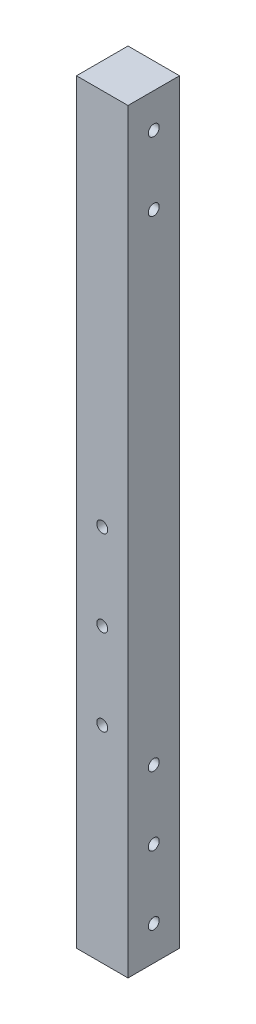
ISO-10303-21;
HEADER;
FILE_DESCRIPTION(('STEP AP214'),'2;1');
FILE_NAME('part.step','',(''),(''),'','','');
FILE_SCHEMA(('AUTOMOTIVE_DESIGN { 1 0 10303 214 1 1 1 1 }'));
ENDSEC;
DATA;
#1=APPLICATION_CONTEXT('core data for automotive mechanical design processes');
#2=APPLICATION_PROTOCOL_DEFINITION('international standard','automotive_design',2000,#1);
#3=PRODUCT_CONTEXT('',#1,'mechanical');
#4=PRODUCT('Part','Part','',(#3));
#5=PRODUCT_RELATED_PRODUCT_CATEGORY('part','',(#4));
#6=PRODUCT_DEFINITION_FORMATION('','',#4);
#7=PRODUCT_DEFINITION_CONTEXT('part definition',#1,'design');
#8=PRODUCT_DEFINITION('design','',#6,#7);
#9=PRODUCT_DEFINITION_SHAPE('','',#8);
#10=(LENGTH_UNIT() NAMED_UNIT(*) SI_UNIT(.MILLI.,.METRE.));
#11=(NAMED_UNIT(*) PLANE_ANGLE_UNIT() SI_UNIT($,.RADIAN.));
#12=(NAMED_UNIT(*) SI_UNIT($,.STERADIAN.) SOLID_ANGLE_UNIT());
#13=UNCERTAINTY_MEASURE_WITH_UNIT(LENGTH_MEASURE(1.E-05),#10,'distance_accuracy_value','');
#14=(GEOMETRIC_REPRESENTATION_CONTEXT(3) GLOBAL_UNCERTAINTY_ASSIGNED_CONTEXT((#13)) GLOBAL_UNIT_ASSIGNED_CONTEXT((#10,
#11,#12)) REPRESENTATION_CONTEXT('',''));
#15=CARTESIAN_POINT('',(0.,0.,0.));
#16=DIRECTION('',(0.,0.,1.));
#17=DIRECTION('',(1.,0.,0.));
#18=AXIS2_PLACEMENT_3D('',#15,#16,#17);
#19=CARTESIAN_POINT('',(0.,220.,0.));
#20=DIRECTION('',(1.,0.,0.));
#21=DIRECTION('',(0.,0.,-1.));
#22=AXIS2_PLACEMENT_3D('',#19,#20,#21);
#23=PLANE('',#22);
#24=DIRECTION('',(0.,0.,1.));
#25=VECTOR('',#24,1.);
#26=CARTESIAN_POINT('',(0.,0.,0.));
#27=LINE('',#26,#25);
#28=CARTESIAN_POINT('',(0.,0.,-15.));
#29=VERTEX_POINT('',#28);
#30=CARTESIAN_POINT('',(0.,0.,0.));
#31=VERTEX_POINT('',#30);
#32=EDGE_CURVE('E116',#29,#31,#27,.T.);
#33=ORIENTED_EDGE('',*,*,#32,.T.);
#34=DIRECTION('',(0.,-1.,0.));
#35=VECTOR('',#34,1.);
#36=CARTESIAN_POINT('',(0.,220.,0.));
#37=LINE('',#36,#35);
#38=CARTESIAN_POINT('',(0.,220.,0.));
#39=VERTEX_POINT('',#38);
#40=EDGE_CURVE('E11',#39,#31,#37,.T.);
#41=ORIENTED_EDGE('',*,*,#40,.F.);
#42=DIRECTION('',(0.,0.,1.));
#43=VECTOR('',#42,1.);
#44=CARTESIAN_POINT('',(0.,220.,0.));
#45=LINE('',#44,#43);
#46=CARTESIAN_POINT('',(0.,220.,-15.));
#47=VERTEX_POINT('',#46);
#48=EDGE_CURVE('E101',#47,#39,#45,.T.);
#49=ORIENTED_EDGE('',*,*,#48,.F.);
#50=DIRECTION('',(0.,-1.,0.));
#51=VECTOR('',#50,1.);
#52=CARTESIAN_POINT('',(0.,220.,-15.));
#53=LINE('',#52,#51);
#54=EDGE_CURVE('E111',#47,#29,#53,.T.);
#55=ORIENTED_EDGE('',*,*,#54,.T.);
#56=EDGE_LOOP('',(#33,#41,#49,#55));
#57=FACE_BOUND('',#56,.T.);
#58=CARTESIAN_POINT('',(-1.20000000006226E-05,50.,-7.5));
#59=DIRECTION('',(-1.,0.,0.));
#60=DIRECTION('',(0.,0.,1.));
#61=AXIS2_PLACEMENT_3D('',#58,#59,#60);
#62=CIRCLE('',#61,1.6);
#63=CARTESIAN_POINT('',(-1.20000000006226E-05,50.,-5.9));
#64=VERTEX_POINT('',#63);
#65=EDGE_CURVE('E139',#64,#64,#62,.T.);
#66=ORIENTED_EDGE('',*,*,#65,.F.);
#67=EDGE_LOOP('',(#66));
#68=FACE_BOUND('',#67,.T.);
#69=CARTESIAN_POINT('',(-1.20000000006226E-05,10.,-7.5));
#70=DIRECTION('',(-1.,0.,0.));
#71=DIRECTION('',(0.,0.,1.));
#72=AXIS2_PLACEMENT_3D('',#69,#70,#71);
#73=CIRCLE('',#72,1.6);
#74=CARTESIAN_POINT('',(-1.20000000006226E-05,10.,-5.9));
#75=VERTEX_POINT('',#74);
#76=EDGE_CURVE('E147',#75,#75,#73,.T.);
#77=ORIENTED_EDGE('',*,*,#76,.F.);
#78=EDGE_LOOP('',(#77));
#79=FACE_BOUND('',#78,.T.);
#80=CARTESIAN_POINT('',(-1.20000000006226E-05,30.,-7.5));
#81=DIRECTION('',(-1.,0.,0.));
#82=DIRECTION('',(0.,0.,1.));
#83=AXIS2_PLACEMENT_3D('',#80,#81,#82);
#84=CIRCLE('',#83,1.6);
#85=CARTESIAN_POINT('',(-1.20000000006226E-05,30.,-5.9));
#86=VERTEX_POINT('',#85);
#87=EDGE_CURVE('E162',#86,#86,#84,.T.);
#88=ORIENTED_EDGE('',*,*,#87,.F.);
#89=EDGE_LOOP('',(#88));
#90=FACE_BOUND('',#89,.T.);
#91=CARTESIAN_POINT('',(-1.20000000006226E-05,210.,-7.50000000000002));
#92=DIRECTION('',(-1.,0.,0.));
#93=DIRECTION('',(0.,0.,1.));
#94=AXIS2_PLACEMENT_3D('',#91,#92,#93);
#95=CIRCLE('',#94,1.59999999999999);
#96=CARTESIAN_POINT('',(-1.20000000006226E-05,210.,-5.90000000000003));
#97=VERTEX_POINT('',#96);
#98=EDGE_CURVE('E178',#97,#97,#95,.T.);
#99=ORIENTED_EDGE('',*,*,#98,.F.);
#100=EDGE_LOOP('',(#99));
#101=FACE_BOUND('',#100,.T.);
#102=CARTESIAN_POINT('',(-1.20000000006226E-05,190.,-7.50000000000002));
#103=DIRECTION('',(-1.,0.,0.));
#104=DIRECTION('',(0.,0.,1.));
#105=AXIS2_PLACEMENT_3D('',#102,#103,#104);
#106=CIRCLE('',#105,1.59999999999999);
#107=CARTESIAN_POINT('',(-1.20000000006226E-05,190.,-5.90000000000003));
#108=VERTEX_POINT('',#107);
#109=EDGE_CURVE('E190',#108,#108,#106,.T.);
#110=ORIENTED_EDGE('',*,*,#109,.F.);
#111=EDGE_LOOP('',(#110));
#112=FACE_BOUND('',#111,.T.);
#113=ADVANCED_FACE('F44',(#57,#68,#79,#90,#101,#112),#23,.F.);
#114=CARTESIAN_POINT('',(0.,220.,0.));
#115=DIRECTION('',(0.,0.,-1.));
#116=DIRECTION('',(-1.,0.,0.));
#117=AXIS2_PLACEMENT_3D('',#114,#115,#116);
#118=PLANE('',#117);
#119=CARTESIAN_POINT('',(7.5,60.,0.));
#120=DIRECTION('',(0.,0.,1.));
#121=DIRECTION('',(1.,0.,0.));
#122=AXIS2_PLACEMENT_3D('',#119,#120,#121);
#123=CIRCLE('',#122,1.6);
#124=CARTESIAN_POINT('',(9.1,60.,0.));
#125=VERTEX_POINT('',#124);
#126=EDGE_CURVE('E250',#125,#125,#123,.T.);
#127=ORIENTED_EDGE('',*,*,#126,.F.);
#128=EDGE_LOOP('',(#127));
#129=FACE_BOUND('',#128,.T.);
#130=CARTESIAN_POINT('',(7.5,85.,0.));
#131=DIRECTION('',(0.,0.,1.));
#132=DIRECTION('',(1.,0.,0.));
#133=AXIS2_PLACEMENT_3D('',#130,#131,#132);
#134=CIRCLE('',#133,1.6);
#135=CARTESIAN_POINT('',(9.1,85.,0.));
#136=VERTEX_POINT('',#135);
#137=EDGE_CURVE('E251',#136,#136,#134,.T.);
#138=ORIENTED_EDGE('',*,*,#137,.F.);
#139=EDGE_LOOP('',(#138));
#140=FACE_BOUND('',#139,.T.);
#141=CARTESIAN_POINT('',(7.5,110.,0.));
#142=DIRECTION('',(0.,0.,1.));
#143=DIRECTION('',(1.,0.,0.));
#144=AXIS2_PLACEMENT_3D('',#141,#142,#143);
#145=CIRCLE('',#144,1.6);
#146=CARTESIAN_POINT('',(9.1,110.,0.));
#147=VERTEX_POINT('',#146);
#148=EDGE_CURVE('E261',#147,#147,#145,.T.);
#149=ORIENTED_EDGE('',*,*,#148,.F.);
#150=EDGE_LOOP('',(#149));
#151=FACE_BOUND('',#150,.T.);
#152=DIRECTION('',(1.,0.,0.));
#153=VECTOR('',#152,1.);
#154=CARTESIAN_POINT('',(0.,0.,0.));
#155=LINE('',#154,#153);
#156=CARTESIAN_POINT('',(15.,0.,0.));
#157=VERTEX_POINT('',#156);
#158=EDGE_CURVE('E106',#31,#157,#155,.T.);
#159=ORIENTED_EDGE('',*,*,#158,.T.);
#160=DIRECTION('',(0.,-1.,0.));
#161=VECTOR('',#160,1.);
#162=CARTESIAN_POINT('',(15.,220.,0.));
#163=LINE('',#162,#161);
#164=CARTESIAN_POINT('',(15.,220.,0.));
#165=VERTEX_POINT('',#164);
#166=EDGE_CURVE('E60',#165,#157,#163,.T.);
#167=ORIENTED_EDGE('',*,*,#166,.F.);
#168=DIRECTION('',(1.,0.,0.));
#169=VECTOR('',#168,1.);
#170=CARTESIAN_POINT('',(0.,220.,0.));
#171=LINE('',#170,#169);
#172=EDGE_CURVE('E96',#39,#165,#171,.T.);
#173=ORIENTED_EDGE('',*,*,#172,.F.);
#174=ORIENTED_EDGE('',*,*,#40,.T.);
#175=EDGE_LOOP('',(#159,#167,#173,#174));
#176=FACE_BOUND('',#175,.T.);
#177=ADVANCED_FACE('F104',(#129,#140,#151,#176),#118,.F.);
#178=CARTESIAN_POINT('',(15.,220.,0.));
#179=DIRECTION('',(-1.,0.,0.));
#180=DIRECTION('',(0.,0.,1.));
#181=AXIS2_PLACEMENT_3D('',#178,#179,#180);
#182=PLANE('',#181);
#183=CARTESIAN_POINT('',(15.,190.,-7.50000000000002));
#184=DIRECTION('',(-1.,0.,0.));
#185=DIRECTION('',(0.,0.,1.));
#186=AXIS2_PLACEMENT_3D('',#183,#184,#185);
#187=CIRCLE('',#186,1.59999999999999);
#188=CARTESIAN_POINT('',(15.,190.,-5.90000000000003));
#189=VERTEX_POINT('',#188);
#190=EDGE_CURVE('E194',#189,#189,#187,.T.);
#191=ORIENTED_EDGE('',*,*,#190,.T.);
#192=EDGE_LOOP('',(#191));
#193=FACE_BOUND('',#192,.T.);
#194=CARTESIAN_POINT('',(15.,210.,-7.50000000000002));
#195=DIRECTION('',(-1.,0.,0.));
#196=DIRECTION('',(0.,0.,1.));
#197=AXIS2_PLACEMENT_3D('',#194,#195,#196);
#198=CIRCLE('',#197,1.59999999999999);
#199=CARTESIAN_POINT('',(15.,210.,-5.90000000000003));
#200=VERTEX_POINT('',#199);
#201=EDGE_CURVE('E193',#200,#200,#198,.T.);
#202=ORIENTED_EDGE('',*,*,#201,.T.);
#203=EDGE_LOOP('',(#202));
#204=FACE_BOUND('',#203,.T.);
#205=CARTESIAN_POINT('',(15.,30.,-7.5));
#206=DIRECTION('',(-1.,0.,0.));
#207=DIRECTION('',(0.,0.,1.));
#208=AXIS2_PLACEMENT_3D('',#205,#206,#207);
#209=CIRCLE('',#208,1.6);
#210=CARTESIAN_POINT('',(15.,30.,-5.9));
#211=VERTEX_POINT('',#210);
#212=EDGE_CURVE('E277',#211,#211,#209,.T.);
#213=ORIENTED_EDGE('',*,*,#212,.T.);
#214=EDGE_LOOP('',(#213));
#215=FACE_BOUND('',#214,.T.);
#216=CARTESIAN_POINT('',(15.,10.,-7.5));
#217=DIRECTION('',(-1.,0.,0.));
#218=DIRECTION('',(0.,0.,1.));
#219=AXIS2_PLACEMENT_3D('',#216,#217,#218);
#220=CIRCLE('',#219,1.6);
#221=CARTESIAN_POINT('',(15.,10.,-5.9));
#222=VERTEX_POINT('',#221);
#223=EDGE_CURVE('E271',#222,#222,#220,.T.);
#224=ORIENTED_EDGE('',*,*,#223,.T.);
#225=EDGE_LOOP('',(#224));
#226=FACE_BOUND('',#225,.T.);
#227=CARTESIAN_POINT('',(15.,50.,-7.5));
#228=DIRECTION('',(-1.,0.,0.));
#229=DIRECTION('',(0.,0.,1.));
#230=AXIS2_PLACEMENT_3D('',#227,#228,#229);
#231=CIRCLE('',#230,1.6);
#232=CARTESIAN_POINT('',(15.,50.,-5.9));
#233=VERTEX_POINT('',#232);
#234=EDGE_CURVE('E201',#233,#233,#231,.T.);
#235=ORIENTED_EDGE('',*,*,#234,.T.);
#236=EDGE_LOOP('',(#235));
#237=FACE_BOUND('',#236,.T.);
#238=DIRECTION('',(0.,0.,-1.));
#239=VECTOR('',#238,1.);
#240=CARTESIAN_POINT('',(15.,0.,0.));
#241=LINE('',#240,#239);
#242=CARTESIAN_POINT('',(15.,0.,-15.));
#243=VERTEX_POINT('',#242);
#244=EDGE_CURVE('E82',#157,#243,#241,.T.);
#245=ORIENTED_EDGE('',*,*,#244,.T.);
#246=DIRECTION('',(0.,-1.,0.));
#247=VECTOR('',#246,1.);
#248=CARTESIAN_POINT('',(15.,220.,-15.));
#249=LINE('',#248,#247);
#250=CARTESIAN_POINT('',(15.,220.,-15.));
#251=VERTEX_POINT('',#250);
#252=EDGE_CURVE('E107',#251,#243,#249,.T.);
#253=ORIENTED_EDGE('',*,*,#252,.F.);
#254=DIRECTION('',(0.,0.,-1.));
#255=VECTOR('',#254,1.);
#256=CARTESIAN_POINT('',(15.,220.,0.));
#257=LINE('',#256,#255);
#258=EDGE_CURVE('E97',#165,#251,#257,.T.);
#259=ORIENTED_EDGE('',*,*,#258,.F.);
#260=ORIENTED_EDGE('',*,*,#166,.T.);
#261=EDGE_LOOP('',(#245,#253,#259,#260));
#262=FACE_BOUND('',#261,.T.);
#263=ADVANCED_FACE('F109',(#193,#204,#215,#226,#237,#262),#182,.F.);
#264=CARTESIAN_POINT('',(0.,220.,-15.));
#265=DIRECTION('',(0.,0.,1.));
#266=DIRECTION('',(1.,0.,0.));
#267=AXIS2_PLACEMENT_3D('',#264,#265,#266);
#268=PLANE('',#267);
#269=CARTESIAN_POINT('',(7.5,60.,-15.));
#270=DIRECTION('',(0.,0.,1.));
#271=DIRECTION('',(1.,0.,0.));
#272=AXIS2_PLACEMENT_3D('',#269,#270,#271);
#273=CIRCLE('',#272,1.6);
#274=CARTESIAN_POINT('',(9.1,60.,-15.));
#275=VERTEX_POINT('',#274);
#276=EDGE_CURVE('E124',#275,#275,#273,.T.);
#277=ORIENTED_EDGE('',*,*,#276,.T.);
#278=EDGE_LOOP('',(#277));
#279=FACE_BOUND('',#278,.T.);
#280=CARTESIAN_POINT('',(7.5,85.,-15.));
#281=DIRECTION('',(0.,0.,1.));
#282=DIRECTION('',(1.,0.,0.));
#283=AXIS2_PLACEMENT_3D('',#280,#281,#282);
#284=CIRCLE('',#283,1.6);
#285=CARTESIAN_POINT('',(9.1,85.,-15.));
#286=VERTEX_POINT('',#285);
#287=EDGE_CURVE('E260',#286,#286,#284,.T.);
#288=ORIENTED_EDGE('',*,*,#287,.T.);
#289=EDGE_LOOP('',(#288));
#290=FACE_BOUND('',#289,.T.);
#291=CARTESIAN_POINT('',(7.5,110.,-15.));
#292=DIRECTION('',(0.,0.,1.));
#293=DIRECTION('',(1.,0.,0.));
#294=AXIS2_PLACEMENT_3D('',#291,#292,#293);
#295=CIRCLE('',#294,1.6);
#296=CARTESIAN_POINT('',(9.1,110.,-15.));
#297=VERTEX_POINT('',#296);
#298=EDGE_CURVE('E206',#297,#297,#295,.T.);
#299=ORIENTED_EDGE('',*,*,#298,.T.);
#300=EDGE_LOOP('',(#299));
#301=FACE_BOUND('',#300,.T.);
#302=DIRECTION('',(-1.,0.,0.));
#303=VECTOR('',#302,1.);
#304=CARTESIAN_POINT('',(0.,0.,-15.));
#305=LINE('',#304,#303);
#306=EDGE_CURVE('E90',#243,#29,#305,.T.);
#307=ORIENTED_EDGE('',*,*,#306,.T.);
#308=ORIENTED_EDGE('',*,*,#54,.F.);
#309=DIRECTION('',(-1.,0.,0.));
#310=VECTOR('',#309,1.);
#311=CARTESIAN_POINT('',(0.,220.,-15.));
#312=LINE('',#311,#310);
#313=EDGE_CURVE('E68',#251,#47,#312,.T.);
#314=ORIENTED_EDGE('',*,*,#313,.F.);
#315=ORIENTED_EDGE('',*,*,#252,.T.);
#316=EDGE_LOOP('',(#307,#308,#314,#315));
#317=FACE_BOUND('',#316,.T.);
#318=ADVANCED_FACE('F310',(#279,#290,#301,#317),#268,.F.);
#319=CARTESIAN_POINT('',(0.,220.,0.));
#320=DIRECTION('',(0.,-1.,0.));
#321=DIRECTION('',(0.,0.,-1.));
#322=AXIS2_PLACEMENT_3D('',#319,#320,#321);
#323=PLANE('',#322);
#324=ORIENTED_EDGE('',*,*,#48,.T.);
#325=ORIENTED_EDGE('',*,*,#172,.T.);
#326=ORIENTED_EDGE('',*,*,#258,.T.);
#327=ORIENTED_EDGE('',*,*,#313,.T.);
#328=EDGE_LOOP('',(#324,#325,#326,#327));
#329=FACE_BOUND('',#328,.T.);
#330=ADVANCED_FACE('F100',(#329),#323,.F.);
#331=CARTESIAN_POINT('',(0.,0.,0.));
#332=DIRECTION('',(0.,-1.,0.));
#333=DIRECTION('',(0.,0.,-1.));
#334=AXIS2_PLACEMENT_3D('',#331,#332,#333);
#335=PLANE('',#334);
#336=ORIENTED_EDGE('',*,*,#32,.F.);
#337=ORIENTED_EDGE('',*,*,#306,.F.);
#338=ORIENTED_EDGE('',*,*,#244,.F.);
#339=ORIENTED_EDGE('',*,*,#158,.F.);
#340=EDGE_LOOP('',(#336,#337,#338,#339));
#341=FACE_BOUND('',#340,.T.);
#342=ADVANCED_FACE('F296',(#341),#335,.T.);
#343=CARTESIAN_POINT('',(7.5,110.,-15.));
#344=DIRECTION('',(0.,0.,1.));
#345=DIRECTION('',(1.,0.,0.));
#346=AXIS2_PLACEMENT_3D('',#343,#344,#345);
#347=CYLINDRICAL_SURFACE('',#346,1.6);
#348=ORIENTED_EDGE('',*,*,#298,.F.);
#349=EDGE_LOOP('',(#348));
#350=FACE_BOUND('',#349,.T.);
#351=ORIENTED_EDGE('',*,*,#148,.T.);
#352=EDGE_LOOP('',(#351));
#353=FACE_BOUND('',#352,.T.);
#354=ADVANCED_FACE('F297',(#350,#353),#347,.F.);
#355=CARTESIAN_POINT('',(7.5,85.,-15.));
#356=DIRECTION('',(0.,0.,1.));
#357=DIRECTION('',(1.,0.,0.));
#358=AXIS2_PLACEMENT_3D('',#355,#356,#357);
#359=CYLINDRICAL_SURFACE('',#358,1.6);
#360=ORIENTED_EDGE('',*,*,#287,.F.);
#361=EDGE_LOOP('',(#360));
#362=FACE_BOUND('',#361,.T.);
#363=ORIENTED_EDGE('',*,*,#137,.T.);
#364=EDGE_LOOP('',(#363));
#365=FACE_BOUND('',#364,.T.);
#366=ADVANCED_FACE('F308',(#362,#365),#359,.F.);
#367=CARTESIAN_POINT('',(7.5,60.,-15.));
#368=DIRECTION('',(0.,0.,1.));
#369=DIRECTION('',(1.,0.,0.));
#370=AXIS2_PLACEMENT_3D('',#367,#368,#369);
#371=CYLINDRICAL_SURFACE('',#370,1.6);
#372=ORIENTED_EDGE('',*,*,#276,.F.);
#373=EDGE_LOOP('',(#372));
#374=FACE_BOUND('',#373,.T.);
#375=ORIENTED_EDGE('',*,*,#126,.T.);
#376=EDGE_LOOP('',(#375));
#377=FACE_BOUND('',#376,.T.);
#378=ADVANCED_FACE('F234',(#374,#377),#371,.F.);
#379=CARTESIAN_POINT('',(15.,50.,-7.5));
#380=DIRECTION('',(-1.,0.,0.));
#381=DIRECTION('',(0.,0.,1.));
#382=AXIS2_PLACEMENT_3D('',#379,#380,#381);
#383=CYLINDRICAL_SURFACE('',#382,1.6);
#384=ORIENTED_EDGE('',*,*,#234,.F.);
#385=EDGE_LOOP('',(#384));
#386=FACE_BOUND('',#385,.T.);
#387=ORIENTED_EDGE('',*,*,#65,.T.);
#388=EDGE_LOOP('',(#387));
#389=FACE_BOUND('',#388,.T.);
#390=ADVANCED_FACE('F230',(#386,#389),#383,.F.);
#391=CARTESIAN_POINT('',(15.,10.,-7.5));
#392=DIRECTION('',(-1.,0.,0.));
#393=DIRECTION('',(0.,0.,1.));
#394=AXIS2_PLACEMENT_3D('',#391,#392,#393);
#395=CYLINDRICAL_SURFACE('',#394,1.6);
#396=ORIENTED_EDGE('',*,*,#223,.F.);
#397=EDGE_LOOP('',(#396));
#398=FACE_BOUND('',#397,.T.);
#399=ORIENTED_EDGE('',*,*,#76,.T.);
#400=EDGE_LOOP('',(#399));
#401=FACE_BOUND('',#400,.T.);
#402=ADVANCED_FACE('F233',(#398,#401),#395,.F.);
#403=CARTESIAN_POINT('',(15.,30.,-7.5));
#404=DIRECTION('',(-1.,0.,0.));
#405=DIRECTION('',(0.,0.,1.));
#406=AXIS2_PLACEMENT_3D('',#403,#404,#405);
#407=CYLINDRICAL_SURFACE('',#406,1.6);
#408=ORIENTED_EDGE('',*,*,#212,.F.);
#409=EDGE_LOOP('',(#408));
#410=FACE_BOUND('',#409,.T.);
#411=ORIENTED_EDGE('',*,*,#87,.T.);
#412=EDGE_LOOP('',(#411));
#413=FACE_BOUND('',#412,.T.);
#414=ADVANCED_FACE('F283',(#410,#413),#407,.F.);
#415=CARTESIAN_POINT('',(15.,210.,-7.50000000000002));
#416=DIRECTION('',(-1.,0.,0.));
#417=DIRECTION('',(0.,0.,1.));
#418=AXIS2_PLACEMENT_3D('',#415,#416,#417);
#419=CYLINDRICAL_SURFACE('',#418,1.59999999999999);
#420=ORIENTED_EDGE('',*,*,#201,.F.);
#421=EDGE_LOOP('',(#420));
#422=FACE_BOUND('',#421,.T.);
#423=ORIENTED_EDGE('',*,*,#98,.T.);
#424=EDGE_LOOP('',(#423));
#425=FACE_BOUND('',#424,.T.);
#426=ADVANCED_FACE('F224',(#422,#425),#419,.F.);
#427=CARTESIAN_POINT('',(15.,190.,-7.50000000000002));
#428=DIRECTION('',(-1.,0.,0.));
#429=DIRECTION('',(0.,0.,1.));
#430=AXIS2_PLACEMENT_3D('',#427,#428,#429);
#431=CYLINDRICAL_SURFACE('',#430,1.59999999999999);
#432=ORIENTED_EDGE('',*,*,#190,.F.);
#433=EDGE_LOOP('',(#432));
#434=FACE_BOUND('',#433,.T.);
#435=ORIENTED_EDGE('',*,*,#109,.T.);
#436=EDGE_LOOP('',(#435));
#437=FACE_BOUND('',#436,.T.);
#438=ADVANCED_FACE('F213',(#434,#437),#431,.F.);
#439=CLOSED_SHELL('',(#113,#177,#263,#318,#330,#342,#354,#366,#378,#390,#402,#414,#426,#438));
#440=MANIFOLD_SOLID_BREP('B2',#439);
#441=ADVANCED_BREP_SHAPE_REPRESENTATION('',(#18,#440),#14);
#442=SHAPE_DEFINITION_REPRESENTATION(#9,#441);
ENDSEC;
END-ISO-10303-21;
